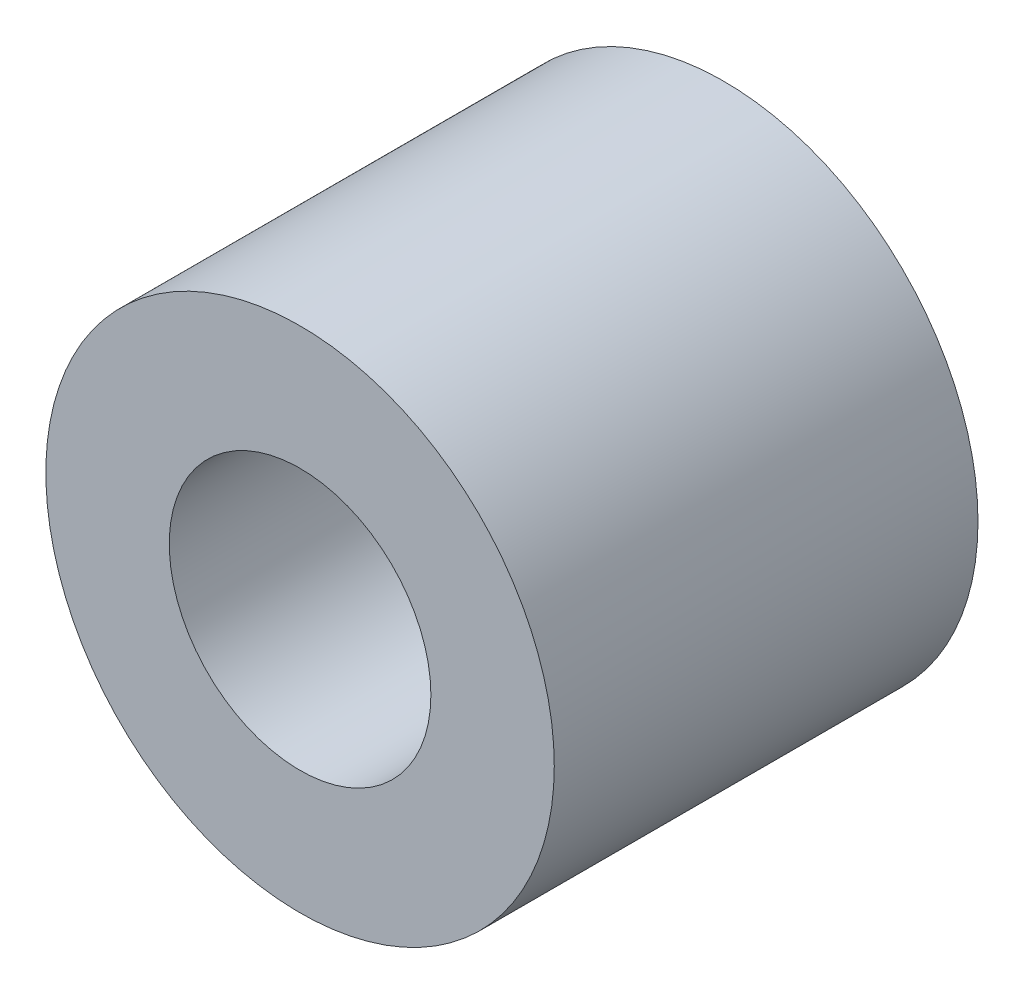
ISO-10303-21;
HEADER;
FILE_DESCRIPTION(('STEP AP214'),'2;1');
FILE_NAME('part.step','',(''),(''),'','','');
FILE_SCHEMA(('AUTOMOTIVE_DESIGN { 1 0 10303 214 1 1 1 1 }'));
ENDSEC;
DATA;
#1=APPLICATION_CONTEXT('core data for automotive mechanical design processes');
#2=APPLICATION_PROTOCOL_DEFINITION('international standard','automotive_design',2000,#1);
#3=PRODUCT_CONTEXT('',#1,'mechanical');
#4=PRODUCT('Part','Part','',(#3));
#5=PRODUCT_RELATED_PRODUCT_CATEGORY('part','',(#4));
#6=PRODUCT_DEFINITION_FORMATION('','',#4);
#7=PRODUCT_DEFINITION_CONTEXT('part definition',#1,'design');
#8=PRODUCT_DEFINITION('design','',#6,#7);
#9=PRODUCT_DEFINITION_SHAPE('','',#8);
#10=(LENGTH_UNIT() NAMED_UNIT(*) SI_UNIT(.MILLI.,.METRE.));
#11=(NAMED_UNIT(*) PLANE_ANGLE_UNIT() SI_UNIT($,.RADIAN.));
#12=(NAMED_UNIT(*) SI_UNIT($,.STERADIAN.) SOLID_ANGLE_UNIT());
#13=UNCERTAINTY_MEASURE_WITH_UNIT(LENGTH_MEASURE(1.E-05),#10,'distance_accuracy_value','');
#14=(GEOMETRIC_REPRESENTATION_CONTEXT(3) GLOBAL_UNCERTAINTY_ASSIGNED_CONTEXT((#13)) GLOBAL_UNIT_ASSIGNED_CONTEXT((#10,
#11,#12)) REPRESENTATION_CONTEXT('',''));
#15=CARTESIAN_POINT('',(0.,0.,0.));
#16=DIRECTION('',(0.,0.,1.));
#17=DIRECTION('',(1.,0.,0.));
#18=AXIS2_PLACEMENT_3D('',#15,#16,#17);
#19=CARTESIAN_POINT('',(0.,0.,5.));
#20=DIRECTION('',(0.,0.,1.));
#21=DIRECTION('',(1.,0.,0.));
#22=AXIS2_PLACEMENT_3D('',#19,#20,#21);
#23=PLANE('',#22);
#24=CARTESIAN_POINT('',(0.,0.,5.));
#25=DIRECTION('',(0.,0.,1.));
#26=DIRECTION('',(1.,0.,0.));
#27=AXIS2_PLACEMENT_3D('',#24,#25,#26);
#28=CIRCLE('',#27,6.);
#29=CARTESIAN_POINT('',(6.,0.,5.));
#30=VERTEX_POINT('',#29);
#31=EDGE_CURVE('E10',#30,#30,#28,.T.);
#32=ORIENTED_EDGE('',*,*,#31,.T.);
#33=EDGE_LOOP('',(#32));
#34=FACE_BOUND('',#33,.T.);
#35=CARTESIAN_POINT('',(0.,0.,5.));
#36=DIRECTION('',(0.,0.,1.));
#37=DIRECTION('',(1.,0.,0.));
#38=AXIS2_PLACEMENT_3D('',#35,#36,#37);
#39=CIRCLE('',#38,3.0875);
#40=CARTESIAN_POINT('',(3.0875,0.,5.));
#41=VERTEX_POINT('',#40);
#42=EDGE_CURVE('E46',#41,#41,#39,.T.);
#43=ORIENTED_EDGE('',*,*,#42,.F.);
#44=EDGE_LOOP('',(#43));
#45=FACE_BOUND('',#44,.T.);
#46=ADVANCED_FACE('F35',(#34,#45),#23,.T.);
#47=CARTESIAN_POINT('',(0.,0.,-5.));
#48=DIRECTION('',(0.,0.,1.));
#49=DIRECTION('',(1.,0.,0.));
#50=AXIS2_PLACEMENT_3D('',#47,#48,#49);
#51=PLANE('',#50);
#52=CARTESIAN_POINT('',(0.,0.,-5.));
#53=DIRECTION('',(0.,0.,1.));
#54=DIRECTION('',(1.,0.,0.));
#55=AXIS2_PLACEMENT_3D('',#52,#53,#54);
#56=CIRCLE('',#55,6.);
#57=CARTESIAN_POINT('',(6.,0.,-5.));
#58=VERTEX_POINT('',#57);
#59=EDGE_CURVE('E39',#58,#58,#56,.T.);
#60=ORIENTED_EDGE('',*,*,#59,.F.);
#61=EDGE_LOOP('',(#60));
#62=FACE_BOUND('',#61,.T.);
#63=CARTESIAN_POINT('',(0.,0.,-5.));
#64=DIRECTION('',(0.,0.,1.));
#65=DIRECTION('',(1.,0.,0.));
#66=AXIS2_PLACEMENT_3D('',#63,#64,#65);
#67=CIRCLE('',#66,3.0875);
#68=CARTESIAN_POINT('',(3.0875,0.,-5.));
#69=VERTEX_POINT('',#68);
#70=EDGE_CURVE('E48',#69,#69,#67,.T.);
#71=ORIENTED_EDGE('',*,*,#70,.T.);
#72=EDGE_LOOP('',(#71));
#73=FACE_BOUND('',#72,.T.);
#74=ADVANCED_FACE('F58',(#62,#73),#51,.F.);
#75=CARTESIAN_POINT('',(0.,0.,5.));
#76=DIRECTION('',(0.,0.,-1.));
#77=DIRECTION('',(-1.,0.,0.));
#78=AXIS2_PLACEMENT_3D('',#75,#76,#77);
#79=CYLINDRICAL_SURFACE('',#78,6.);
#80=ORIENTED_EDGE('',*,*,#31,.F.);
#81=EDGE_LOOP('',(#80));
#82=FACE_BOUND('',#81,.T.);
#83=ORIENTED_EDGE('',*,*,#59,.T.);
#84=EDGE_LOOP('',(#83));
#85=FACE_BOUND('',#84,.T.);
#86=ADVANCED_FACE('F37',(#82,#85),#79,.T.);
#87=CARTESIAN_POINT('',(0.,0.,5.));
#88=DIRECTION('',(0.,0.,-1.));
#89=DIRECTION('',(-1.,0.,0.));
#90=AXIS2_PLACEMENT_3D('',#87,#88,#89);
#91=CYLINDRICAL_SURFACE('',#90,3.0875);
#92=ORIENTED_EDGE('',*,*,#42,.T.);
#93=EDGE_LOOP('',(#92));
#94=FACE_BOUND('',#93,.T.);
#95=ORIENTED_EDGE('',*,*,#70,.F.);
#96=EDGE_LOOP('',(#95));
#97=FACE_BOUND('',#96,.T.);
#98=ADVANCED_FACE('F54',(#94,#97),#91,.F.);
#99=CLOSED_SHELL('',(#46,#74,#86,#98));
#100=MANIFOLD_SOLID_BREP('B2',#99);
#101=ADVANCED_BREP_SHAPE_REPRESENTATION('',(#18,#100),#14);
#102=SHAPE_DEFINITION_REPRESENTATION(#9,#101);
ENDSEC;
END-ISO-10303-21;
